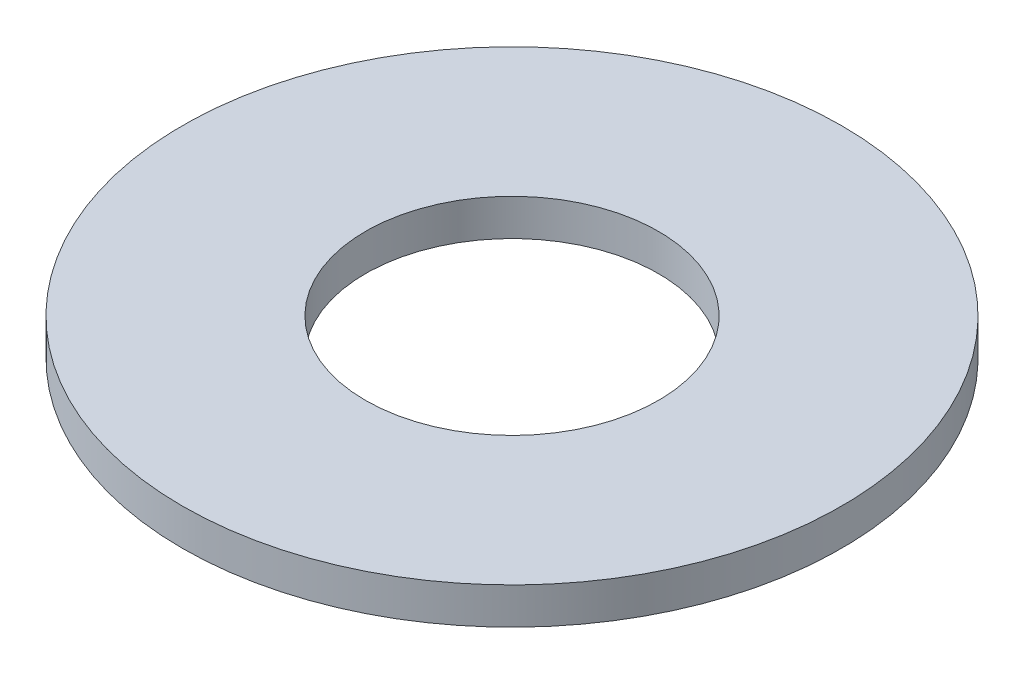
ISO-10303-21;
HEADER;
FILE_DESCRIPTION(('STEP AP214'),'2;1');
FILE_NAME('part.step','',(''),(''),'','','');
FILE_SCHEMA(('AUTOMOTIVE_DESIGN { 1 0 10303 214 1 1 1 1 }'));
ENDSEC;
DATA;
#1=APPLICATION_CONTEXT('core data for automotive mechanical design processes');
#2=APPLICATION_PROTOCOL_DEFINITION('international standard','automotive_design',2000,#1);
#3=PRODUCT_CONTEXT('',#1,'mechanical');
#4=PRODUCT('Part','Part','',(#3));
#5=PRODUCT_RELATED_PRODUCT_CATEGORY('part','',(#4));
#6=PRODUCT_DEFINITION_FORMATION('','',#4);
#7=PRODUCT_DEFINITION_CONTEXT('part definition',#1,'design');
#8=PRODUCT_DEFINITION('design','',#6,#7);
#9=PRODUCT_DEFINITION_SHAPE('','',#8);
#10=(LENGTH_UNIT() NAMED_UNIT(*) SI_UNIT(.MILLI.,.METRE.));
#11=(NAMED_UNIT(*) PLANE_ANGLE_UNIT() SI_UNIT($,.RADIAN.));
#12=(NAMED_UNIT(*) SI_UNIT($,.STERADIAN.) SOLID_ANGLE_UNIT());
#13=UNCERTAINTY_MEASURE_WITH_UNIT(LENGTH_MEASURE(1.E-05),#10,'distance_accuracy_value','');
#14=(GEOMETRIC_REPRESENTATION_CONTEXT(3) GLOBAL_UNCERTAINTY_ASSIGNED_CONTEXT((#13)) GLOBAL_UNIT_ASSIGNED_CONTEXT((#10,
#11,#12)) REPRESENTATION_CONTEXT('',''));
#15=CARTESIAN_POINT('',(0.,0.,0.));
#16=DIRECTION('',(0.,0.,1.));
#17=DIRECTION('',(1.,0.,0.));
#18=AXIS2_PLACEMENT_3D('',#15,#16,#17);
#19=CARTESIAN_POINT('',(0.,0.5,0.));
#20=DIRECTION('',(0.,1.,0.));
#21=DIRECTION('',(0.,0.,1.));
#22=AXIS2_PLACEMENT_3D('',#19,#20,#21);
#23=PLANE('',#22);
#24=CARTESIAN_POINT('',(0.,0.5,0.));
#25=DIRECTION('',(0.,1.,0.));
#26=DIRECTION('',(0.,0.,1.));
#27=AXIS2_PLACEMENT_3D('',#24,#25,#26);
#28=CIRCLE('',#27,4.5);
#29=CARTESIAN_POINT('',(0.,0.5,4.5));
#30=VERTEX_POINT('',#29);
#31=EDGE_CURVE('E10',#30,#30,#28,.T.);
#32=ORIENTED_EDGE('',*,*,#31,.T.);
#33=EDGE_LOOP('',(#32));
#34=FACE_BOUND('',#33,.T.);
#35=CARTESIAN_POINT('',(0.,0.5,0.));
#36=DIRECTION('',(0.,1.,0.));
#37=DIRECTION('',(0.,0.,1.));
#38=AXIS2_PLACEMENT_3D('',#35,#36,#37);
#39=CIRCLE('',#38,2.);
#40=CARTESIAN_POINT('',(0.,0.5,2.));
#41=VERTEX_POINT('',#40);
#42=EDGE_CURVE('E54',#41,#41,#39,.T.);
#43=ORIENTED_EDGE('',*,*,#42,.F.);
#44=EDGE_LOOP('',(#43));
#45=FACE_BOUND('',#44,.T.);
#46=ADVANCED_FACE('F41',(#34,#45),#23,.T.);
#47=CARTESIAN_POINT('',(0.,0.,0.));
#48=DIRECTION('',(0.,1.,0.));
#49=DIRECTION('',(0.,0.,1.));
#50=AXIS2_PLACEMENT_3D('',#47,#48,#49);
#51=PLANE('',#50);
#52=CARTESIAN_POINT('',(0.,0.,0.));
#53=DIRECTION('',(0.,1.,0.));
#54=DIRECTION('',(0.,0.,1.));
#55=AXIS2_PLACEMENT_3D('',#52,#53,#54);
#56=CIRCLE('',#55,4.5);
#57=CARTESIAN_POINT('',(0.,0.,4.5));
#58=VERTEX_POINT('',#57);
#59=EDGE_CURVE('E45',#58,#58,#56,.T.);
#60=ORIENTED_EDGE('',*,*,#59,.F.);
#61=EDGE_LOOP('',(#60));
#62=FACE_BOUND('',#61,.T.);
#63=CARTESIAN_POINT('',(0.,0.,0.));
#64=DIRECTION('',(0.,1.,0.));
#65=DIRECTION('',(0.,0.,1.));
#66=AXIS2_PLACEMENT_3D('',#63,#64,#65);
#67=CIRCLE('',#66,2.);
#68=CARTESIAN_POINT('',(0.,0.,2.));
#69=VERTEX_POINT('',#68);
#70=EDGE_CURVE('E56',#69,#69,#67,.T.);
#71=ORIENTED_EDGE('',*,*,#70,.T.);
#72=EDGE_LOOP('',(#71));
#73=FACE_BOUND('',#72,.T.);
#74=ADVANCED_FACE('F68',(#62,#73),#51,.F.);
#75=CARTESIAN_POINT('',(0.,0.5,0.));
#76=DIRECTION('',(0.,-1.,0.));
#77=DIRECTION('',(0.,0.,-1.));
#78=AXIS2_PLACEMENT_3D('',#75,#76,#77);
#79=CYLINDRICAL_SURFACE('',#78,4.5);
#80=ORIENTED_EDGE('',*,*,#31,.F.);
#81=EDGE_LOOP('',(#80));
#82=FACE_BOUND('',#81,.T.);
#83=ORIENTED_EDGE('',*,*,#59,.T.);
#84=EDGE_LOOP('',(#83));
#85=FACE_BOUND('',#84,.T.);
#86=ADVANCED_FACE('F43',(#82,#85),#79,.T.);
#87=CARTESIAN_POINT('',(0.,0.5,0.));
#88=DIRECTION('',(0.,-1.,0.));
#89=DIRECTION('',(0.,0.,-1.));
#90=AXIS2_PLACEMENT_3D('',#87,#88,#89);
#91=CYLINDRICAL_SURFACE('',#90,2.);
#92=ORIENTED_EDGE('',*,*,#42,.T.);
#93=EDGE_LOOP('',(#92));
#94=FACE_BOUND('',#93,.T.);
#95=ORIENTED_EDGE('',*,*,#70,.F.);
#96=EDGE_LOOP('',(#95));
#97=FACE_BOUND('',#96,.T.);
#98=ADVANCED_FACE('F64',(#94,#97),#91,.F.);
#99=CLOSED_SHELL('',(#46,#74,#86,#98));
#100=MANIFOLD_SOLID_BREP('B2',#99);
#101=ADVANCED_BREP_SHAPE_REPRESENTATION('',(#18,#100),#14);
#102=SHAPE_DEFINITION_REPRESENTATION(#9,#101);
ENDSEC;
END-ISO-10303-21;
